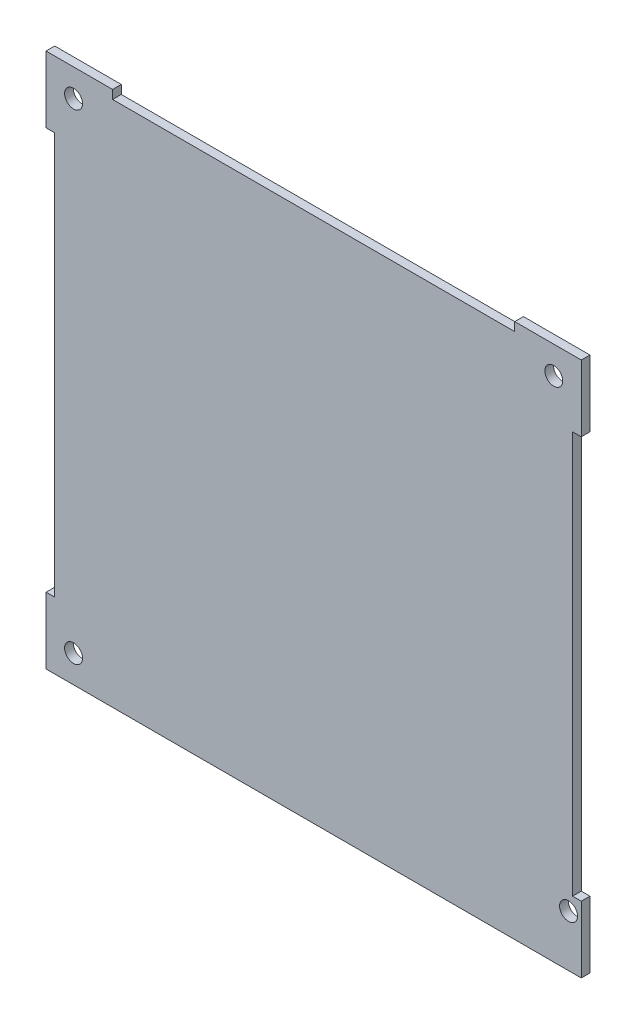
ISO-10303-21;
HEADER;
FILE_DESCRIPTION(('STEP AP214'),'2;1');
FILE_NAME('part.step','',(''),(''),'','','');
FILE_SCHEMA(('AUTOMOTIVE_DESIGN { 1 0 10303 214 1 1 1 1 }'));
ENDSEC;
DATA;
#1=APPLICATION_CONTEXT('core data for automotive mechanical design processes');
#2=APPLICATION_PROTOCOL_DEFINITION('international standard','automotive_design',2000,#1);
#3=PRODUCT_CONTEXT('',#1,'mechanical');
#4=PRODUCT('Part','Part','',(#3));
#5=PRODUCT_RELATED_PRODUCT_CATEGORY('part','',(#4));
#6=PRODUCT_DEFINITION_FORMATION('','',#4);
#7=PRODUCT_DEFINITION_CONTEXT('part definition',#1,'design');
#8=PRODUCT_DEFINITION('design','',#6,#7);
#9=PRODUCT_DEFINITION_SHAPE('','',#8);
#10=(LENGTH_UNIT() NAMED_UNIT(*) SI_UNIT(.MILLI.,.METRE.));
#11=(NAMED_UNIT(*) PLANE_ANGLE_UNIT() SI_UNIT($,.RADIAN.));
#12=(NAMED_UNIT(*) SI_UNIT($,.STERADIAN.) SOLID_ANGLE_UNIT());
#13=UNCERTAINTY_MEASURE_WITH_UNIT(LENGTH_MEASURE(1.E-05),#10,'distance_accuracy_value','');
#14=(GEOMETRIC_REPRESENTATION_CONTEXT(3) GLOBAL_UNCERTAINTY_ASSIGNED_CONTEXT((#13)) GLOBAL_UNIT_ASSIGNED_CONTEXT((#10,
#11,#12)) REPRESENTATION_CONTEXT('',''));
#15=CARTESIAN_POINT('',(0.,0.,0.));
#16=DIRECTION('',(0.,0.,1.));
#17=DIRECTION('',(1.,0.,0.));
#18=AXIS2_PLACEMENT_3D('',#15,#16,#17);
#19=CARTESIAN_POINT('',(46.25,46.25,1.5));
#20=DIRECTION('',(0.,-1.,0.));
#21=DIRECTION('',(1.,0.,0.));
#22=AXIS2_PLACEMENT_3D('',#19,#20,#21);
#23=PLANE('',#22);
#24=DIRECTION('',(-1.,0.,0.));
#25=VECTOR('',#24,1.);
#26=CARTESIAN_POINT('',(46.25,46.25,0.));
#27=LINE('',#26,#25);
#28=CARTESIAN_POINT('',(46.25,46.25,0.));
#29=VERTEX_POINT('',#28);
#30=CARTESIAN_POINT('',(34.75,46.25,0.));
#31=VERTEX_POINT('',#30);
#32=EDGE_CURVE('E282',#29,#31,#27,.T.);
#33=ORIENTED_EDGE('',*,*,#32,.T.);
#34=DIRECTION('',(0.,0.,-1.));
#35=VECTOR('',#34,1.);
#36=CARTESIAN_POINT('',(34.75,46.25,10.));
#37=LINE('',#36,#35);
#38=CARTESIAN_POINT('',(34.75,46.25,1.5));
#39=VERTEX_POINT('',#38);
#40=EDGE_CURVE('E181',#39,#31,#37,.T.);
#41=ORIENTED_EDGE('',*,*,#40,.F.);
#42=DIRECTION('',(-1.,0.,0.));
#43=VECTOR('',#42,1.);
#44=CARTESIAN_POINT('',(46.25,46.25,1.5));
#45=LINE('',#44,#43);
#46=CARTESIAN_POINT('',(46.25,46.25,1.5));
#47=VERTEX_POINT('',#46);
#48=EDGE_CURVE('E269',#47,#39,#45,.T.);
#49=ORIENTED_EDGE('',*,*,#48,.F.);
#50=DIRECTION('',(0.,0.,-1.));
#51=VECTOR('',#50,1.);
#52=CARTESIAN_POINT('',(46.25,46.25,1.5));
#53=LINE('',#52,#51);
#54=EDGE_CURVE('E287',#47,#29,#53,.T.);
#55=ORIENTED_EDGE('',*,*,#54,.T.);
#56=EDGE_LOOP('',(#33,#41,#49,#55));
#57=FACE_BOUND('',#56,.T.);
#58=ADVANCED_FACE('F41',(#57),#23,.F.);
#59=CARTESIAN_POINT('',(-46.25,-46.25,1.5));
#60=DIRECTION('',(1.,0.,0.));
#61=DIRECTION('',(0.,0.,-1.));
#62=AXIS2_PLACEMENT_3D('',#59,#60,#61);
#63=PLANE('',#62);
#64=DIRECTION('',(0.,-1.,0.));
#65=VECTOR('',#64,1.);
#66=CARTESIAN_POINT('',(-46.25,-46.25,0.));
#67=LINE('',#66,#65);
#68=CARTESIAN_POINT('',(-46.25,46.25,0.));
#69=VERTEX_POINT('',#68);
#70=CARTESIAN_POINT('',(-46.25,34.75,0.));
#71=VERTEX_POINT('',#70);
#72=EDGE_CURVE('E273',#69,#71,#67,.T.);
#73=ORIENTED_EDGE('',*,*,#72,.T.);
#74=DIRECTION('',(0.,0.,-1.));
#75=VECTOR('',#74,1.);
#76=CARTESIAN_POINT('',(-46.25,34.75,10.));
#77=LINE('',#76,#75);
#78=CARTESIAN_POINT('',(-46.25,34.75,1.5));
#79=VERTEX_POINT('',#78);
#80=EDGE_CURVE('E196',#79,#71,#77,.T.);
#81=ORIENTED_EDGE('',*,*,#80,.F.);
#82=DIRECTION('',(0.,-1.,0.));
#83=VECTOR('',#82,1.);
#84=CARTESIAN_POINT('',(-46.25,-46.25,1.5));
#85=LINE('',#84,#83);
#86=CARTESIAN_POINT('',(-46.25,46.25,1.5));
#87=VERTEX_POINT('',#86);
#88=EDGE_CURVE('E258',#87,#79,#85,.T.);
#89=ORIENTED_EDGE('',*,*,#88,.F.);
#90=DIRECTION('',(0.,0.,-1.));
#91=VECTOR('',#90,1.);
#92=CARTESIAN_POINT('',(-46.25,46.25,1.5));
#93=LINE('',#92,#91);
#94=EDGE_CURVE('E272',#87,#69,#93,.T.);
#95=ORIENTED_EDGE('',*,*,#94,.T.);
#96=EDGE_LOOP('',(#73,#81,#89,#95));
#97=FACE_BOUND('',#96,.T.);
#98=ADVANCED_FACE('F332',(#97),#63,.F.);
#99=CARTESIAN_POINT('',(46.25,-46.25,1.5));
#100=DIRECTION('',(-1.,0.,0.));
#101=DIRECTION('',(0.,0.,1.));
#102=AXIS2_PLACEMENT_3D('',#99,#100,#101);
#103=PLANE('',#102);
#104=DIRECTION('',(0.,1.,0.));
#105=VECTOR('',#104,1.);
#106=CARTESIAN_POINT('',(46.25,-46.25,1.5));
#107=LINE('',#106,#105);
#108=CARTESIAN_POINT('',(46.25,34.75,1.5));
#109=VERTEX_POINT('',#108);
#110=EDGE_CURVE('E264',#109,#47,#107,.T.);
#111=ORIENTED_EDGE('',*,*,#110,.F.);
#112=DIRECTION('',(0.,0.,-1.));
#113=VECTOR('',#112,1.);
#114=CARTESIAN_POINT('',(46.25,34.75,10.));
#115=LINE('',#114,#113);
#116=CARTESIAN_POINT('',(46.25,34.75,0.));
#117=VERTEX_POINT('',#116);
#118=EDGE_CURVE('E219',#109,#117,#115,.T.);
#119=ORIENTED_EDGE('',*,*,#118,.T.);
#120=DIRECTION('',(0.,1.,0.));
#121=VECTOR('',#120,1.);
#122=CARTESIAN_POINT('',(46.25,-46.25,0.));
#123=LINE('',#122,#121);
#124=EDGE_CURVE('E278',#117,#29,#123,.T.);
#125=ORIENTED_EDGE('',*,*,#124,.T.);
#126=ORIENTED_EDGE('',*,*,#54,.F.);
#127=EDGE_LOOP('',(#111,#119,#125,#126));
#128=FACE_BOUND('',#127,.T.);
#129=ADVANCED_FACE('F344',(#128),#103,.F.);
#130=CARTESIAN_POINT('',(-46.25,-34.75,1.5));
#131=VERTEX_POINT('',#130);
#132=CARTESIAN_POINT('',(-46.25,-46.25,1.5));
#133=VERTEX_POINT('',#132);
#134=EDGE_CURVE('E262',#131,#133,#85,.T.);
#135=ORIENTED_EDGE('',*,*,#134,.F.);
#136=DIRECTION('',(0.,0.,-1.));
#137=VECTOR('',#136,1.);
#138=CARTESIAN_POINT('',(-46.25,-34.75,10.));
#139=LINE('',#138,#137);
#140=CARTESIAN_POINT('',(-46.25,-34.75,0.));
#141=VERTEX_POINT('',#140);
#142=EDGE_CURVE('E199',#131,#141,#139,.T.);
#143=ORIENTED_EDGE('',*,*,#142,.T.);
#144=CARTESIAN_POINT('',(-46.25,-46.25,0.));
#145=VERTEX_POINT('',#144);
#146=EDGE_CURVE('E257',#141,#145,#67,.T.);
#147=ORIENTED_EDGE('',*,*,#146,.T.);
#148=DIRECTION('',(0.,0.,-1.));
#149=VECTOR('',#148,1.);
#150=CARTESIAN_POINT('',(-46.25,-46.25,1.5));
#151=LINE('',#150,#149);
#152=EDGE_CURVE('E11',#133,#145,#151,.T.);
#153=ORIENTED_EDGE('',*,*,#152,.F.);
#154=EDGE_LOOP('',(#135,#143,#147,#153));
#155=FACE_BOUND('',#154,.T.);
#156=ADVANCED_FACE('F43',(#155),#63,.F.);
#157=CARTESIAN_POINT('',(46.25,-46.25,1.5));
#158=DIRECTION('',(0.,1.,0.));
#159=DIRECTION('',(-1.,0.,0.));
#160=AXIS2_PLACEMENT_3D('',#157,#158,#159);
#161=PLANE('',#160);
#162=DIRECTION('',(1.,0.,0.));
#163=VECTOR('',#162,1.);
#164=CARTESIAN_POINT('',(46.25,-46.25,0.));
#165=LINE('',#164,#163);
#166=CARTESIAN_POINT('',(46.25,-46.25,0.));
#167=VERTEX_POINT('',#166);
#168=EDGE_CURVE('E276',#145,#167,#165,.T.);
#169=ORIENTED_EDGE('',*,*,#168,.T.);
#170=DIRECTION('',(0.,0.,-1.));
#171=VECTOR('',#170,1.);
#172=CARTESIAN_POINT('',(46.25,-46.25,1.5));
#173=LINE('',#172,#171);
#174=CARTESIAN_POINT('',(46.25,-46.25,1.5));
#175=VERTEX_POINT('',#174);
#176=EDGE_CURVE('E49',#175,#167,#173,.T.);
#177=ORIENTED_EDGE('',*,*,#176,.F.);
#178=DIRECTION('',(1.,0.,0.));
#179=VECTOR('',#178,1.);
#180=CARTESIAN_POINT('',(46.25,-46.25,1.5));
#181=LINE('',#180,#179);
#182=EDGE_CURVE('E261',#133,#175,#181,.T.);
#183=ORIENTED_EDGE('',*,*,#182,.F.);
#184=ORIENTED_EDGE('',*,*,#152,.T.);
#185=EDGE_LOOP('',(#169,#177,#183,#184));
#186=FACE_BOUND('',#185,.T.);
#187=ADVANCED_FACE('F315',(#186),#161,.F.);
#188=CARTESIAN_POINT('',(46.25,-34.75,0.));
#189=VERTEX_POINT('',#188);
#190=EDGE_CURVE('E279',#167,#189,#123,.T.);
#191=ORIENTED_EDGE('',*,*,#190,.T.);
#192=DIRECTION('',(0.,0.,-1.));
#193=VECTOR('',#192,1.);
#194=CARTESIAN_POINT('',(46.25,-34.75,10.));
#195=LINE('',#194,#193);
#196=CARTESIAN_POINT('',(46.25,-34.75,1.5));
#197=VERTEX_POINT('',#196);
#198=EDGE_CURVE('E218',#197,#189,#195,.T.);
#199=ORIENTED_EDGE('',*,*,#198,.F.);
#200=EDGE_CURVE('E265',#175,#197,#107,.T.);
#201=ORIENTED_EDGE('',*,*,#200,.F.);
#202=ORIENTED_EDGE('',*,*,#176,.T.);
#203=EDGE_LOOP('',(#191,#199,#201,#202));
#204=FACE_BOUND('',#203,.T.);
#205=ADVANCED_FACE('F294',(#204),#103,.F.);
#206=CARTESIAN_POINT('',(-34.75,46.25,1.5));
#207=VERTEX_POINT('',#206);
#208=EDGE_CURVE('E268',#207,#87,#45,.T.);
#209=ORIENTED_EDGE('',*,*,#208,.F.);
#210=DIRECTION('',(0.,0.,-1.));
#211=VECTOR('',#210,1.);
#212=CARTESIAN_POINT('',(-34.75,46.25,10.));
#213=LINE('',#212,#211);
#214=CARTESIAN_POINT('',(-34.75,46.25,0.));
#215=VERTEX_POINT('',#214);
#216=EDGE_CURVE('E165',#207,#215,#213,.T.);
#217=ORIENTED_EDGE('',*,*,#216,.T.);
#218=EDGE_CURVE('E176',#215,#69,#27,.T.);
#219=ORIENTED_EDGE('',*,*,#218,.T.);
#220=ORIENTED_EDGE('',*,*,#94,.F.);
#221=EDGE_LOOP('',(#209,#217,#219,#220));
#222=FACE_BOUND('',#221,.T.);
#223=ADVANCED_FACE('F334',(#222),#23,.F.);
#224=CARTESIAN_POINT('',(0.,0.,1.5));
#225=DIRECTION('',(0.,0.,1.));
#226=DIRECTION('',(1.,0.,0.));
#227=AXIS2_PLACEMENT_3D('',#224,#225,#226);
#228=PLANE('',#227);
#229=DIRECTION('',(0.,1.,0.));
#230=VECTOR('',#229,1.);
#231=CARTESIAN_POINT('',(34.75,0.,1.5));
#232=LINE('',#231,#230);
#233=CARTESIAN_POINT('',(34.75,44.75,1.5));
#234=VERTEX_POINT('',#233);
#235=EDGE_CURVE('E187',#234,#39,#232,.T.);
#236=ORIENTED_EDGE('',*,*,#235,.F.);
#237=DIRECTION('',(1.,0.,0.));
#238=VECTOR('',#237,1.);
#239=CARTESIAN_POINT('',(0.,44.75,1.5));
#240=LINE('',#239,#238);
#241=CARTESIAN_POINT('',(-34.75,44.75,1.5));
#242=VERTEX_POINT('',#241);
#243=EDGE_CURVE('E183',#242,#234,#240,.T.);
#244=ORIENTED_EDGE('',*,*,#243,.F.);
#245=DIRECTION('',(0.,-1.,0.));
#246=VECTOR('',#245,1.);
#247=CARTESIAN_POINT('',(-34.75,0.,1.5));
#248=LINE('',#247,#246);
#249=EDGE_CURVE('E162',#207,#242,#248,.T.);
#250=ORIENTED_EDGE('',*,*,#249,.F.);
#251=ORIENTED_EDGE('',*,*,#208,.T.);
#252=ORIENTED_EDGE('',*,*,#88,.T.);
#253=DIRECTION('',(-1.,0.,0.));
#254=VECTOR('',#253,1.);
#255=CARTESIAN_POINT('',(0.,34.75,1.5));
#256=LINE('',#255,#254);
#257=CARTESIAN_POINT('',(-44.75,34.75,1.5));
#258=VERTEX_POINT('',#257);
#259=EDGE_CURVE('E208',#258,#79,#256,.T.);
#260=ORIENTED_EDGE('',*,*,#259,.F.);
#261=DIRECTION('',(0.,1.,0.));
#262=VECTOR('',#261,1.);
#263=CARTESIAN_POINT('',(-44.75,0.,1.5));
#264=LINE('',#263,#262);
#265=CARTESIAN_POINT('',(-44.75,-34.75,1.5));
#266=VERTEX_POINT('',#265);
#267=EDGE_CURVE('E198',#266,#258,#264,.T.);
#268=ORIENTED_EDGE('',*,*,#267,.F.);
#269=DIRECTION('',(1.,0.,0.));
#270=VECTOR('',#269,1.);
#271=CARTESIAN_POINT('',(0.,-34.75,1.5));
#272=LINE('',#271,#270);
#273=EDGE_CURVE('E206',#131,#266,#272,.T.);
#274=ORIENTED_EDGE('',*,*,#273,.F.);
#275=ORIENTED_EDGE('',*,*,#134,.T.);
#276=ORIENTED_EDGE('',*,*,#182,.T.);
#277=ORIENTED_EDGE('',*,*,#200,.T.);
#278=DIRECTION('',(1.,0.,0.));
#279=VECTOR('',#278,1.);
#280=CARTESIAN_POINT('',(0.,-34.75,1.5));
#281=LINE('',#280,#279);
#282=CARTESIAN_POINT('',(44.75,-34.75,1.5));
#283=VERTEX_POINT('',#282);
#284=EDGE_CURVE('E222',#283,#197,#281,.T.);
#285=ORIENTED_EDGE('',*,*,#284,.F.);
#286=DIRECTION('',(0.,-1.,0.));
#287=VECTOR('',#286,1.);
#288=CARTESIAN_POINT('',(44.75,0.,1.5));
#289=LINE('',#288,#287);
#290=CARTESIAN_POINT('',(44.75,34.75,1.5));
#291=VERTEX_POINT('',#290);
#292=EDGE_CURVE('E229',#291,#283,#289,.T.);
#293=ORIENTED_EDGE('',*,*,#292,.F.);
#294=DIRECTION('',(-1.,0.,0.));
#295=VECTOR('',#294,1.);
#296=CARTESIAN_POINT('',(0.,34.75,1.5));
#297=LINE('',#296,#295);
#298=EDGE_CURVE('E231',#109,#291,#297,.T.);
#299=ORIENTED_EDGE('',*,*,#298,.F.);
#300=ORIENTED_EDGE('',*,*,#110,.T.);
#301=ORIENTED_EDGE('',*,*,#48,.T.);
#302=EDGE_LOOP('',(#236,#244,#250,#251,#252,#260,#268,#274,#275,#276,#277,#285,#293,#299,#300,#301));
#303=FACE_BOUND('',#302,.T.);
#304=CARTESIAN_POINT('',(-41.5000000002001,41.5000000000005,1.5));
#305=DIRECTION('',(0.,0.,1.));
#306=DIRECTION('',(1.,0.,0.));
#307=AXIS2_PLACEMENT_3D('',#304,#305,#306);
#308=CIRCLE('',#307,1.54999999999999);
#309=CARTESIAN_POINT('',(-39.9500000002001,41.5000000000005,1.5));
#310=VERTEX_POINT('',#309);
#311=EDGE_CURVE('E233',#310,#310,#308,.T.);
#312=ORIENTED_EDGE('',*,*,#311,.F.);
#313=EDGE_LOOP('',(#312));
#314=FACE_BOUND('',#313,.T.);
#315=CARTESIAN_POINT('',(41.5,41.5,1.5));
#316=DIRECTION('',(0.,0.,1.));
#317=DIRECTION('',(1.,0.,0.));
#318=AXIS2_PLACEMENT_3D('',#315,#316,#317);
#319=CIRCLE('',#318,1.54999999999999);
#320=CARTESIAN_POINT('',(43.05,41.5,1.5));
#321=VERTEX_POINT('',#320);
#322=EDGE_CURVE('E239',#321,#321,#319,.T.);
#323=ORIENTED_EDGE('',*,*,#322,.F.);
#324=EDGE_LOOP('',(#323));
#325=FACE_BOUND('',#324,.T.);
#326=CARTESIAN_POINT('',(44.0499999999314,-37.3300000000152,1.5));
#327=DIRECTION('',(0.,0.,1.));
#328=DIRECTION('',(1.,0.,0.));
#329=AXIS2_PLACEMENT_3D('',#326,#327,#328);
#330=CIRCLE('',#329,1.54999999999999);
#331=CARTESIAN_POINT('',(45.5999999999314,-37.3300000000152,1.5));
#332=VERTEX_POINT('',#331);
#333=EDGE_CURVE('E245',#332,#332,#330,.T.);
#334=ORIENTED_EDGE('',*,*,#333,.F.);
#335=EDGE_LOOP('',(#334));
#336=FACE_BOUND('',#335,.T.);
#337=CARTESIAN_POINT('',(-41.5,-41.5,1.5));
#338=DIRECTION('',(0.,0.,1.));
#339=DIRECTION('',(1.,0.,0.));
#340=AXIS2_PLACEMENT_3D('',#337,#338,#339);
#341=CIRCLE('',#340,1.54999999999999);
#342=CARTESIAN_POINT('',(-39.9500000000001,-41.5,1.5));
#343=VERTEX_POINT('',#342);
#344=EDGE_CURVE('E251',#343,#343,#341,.T.);
#345=ORIENTED_EDGE('',*,*,#344,.F.);
#346=EDGE_LOOP('',(#345));
#347=FACE_BOUND('',#346,.T.);
#348=ADVANCED_FACE('F309',(#303,#314,#325,#336,#347),#228,.T.);
#349=CARTESIAN_POINT('',(0.,0.,0.));
#350=DIRECTION('',(0.,0.,1.));
#351=DIRECTION('',(1.,0.,0.));
#352=AXIS2_PLACEMENT_3D('',#349,#350,#351);
#353=PLANE('',#352);
#354=CARTESIAN_POINT('',(-41.5000000002001,41.5000000000005,0.));
#355=DIRECTION('',(0.,0.,1.));
#356=DIRECTION('',(1.,0.,0.));
#357=AXIS2_PLACEMENT_3D('',#354,#355,#356);
#358=CIRCLE('',#357,1.55);
#359=CARTESIAN_POINT('',(-39.9500000002001,41.5000000000005,0.));
#360=VERTEX_POINT('',#359);
#361=EDGE_CURVE('E236',#360,#360,#358,.T.);
#362=ORIENTED_EDGE('',*,*,#361,.T.);
#363=EDGE_LOOP('',(#362));
#364=FACE_BOUND('',#363,.T.);
#365=CARTESIAN_POINT('',(41.5,41.5,0.));
#366=DIRECTION('',(0.,0.,1.));
#367=DIRECTION('',(1.,0.,0.));
#368=AXIS2_PLACEMENT_3D('',#365,#366,#367);
#369=CIRCLE('',#368,1.55);
#370=CARTESIAN_POINT('',(43.05,41.5,0.));
#371=VERTEX_POINT('',#370);
#372=EDGE_CURVE('E242',#371,#371,#369,.T.);
#373=ORIENTED_EDGE('',*,*,#372,.T.);
#374=EDGE_LOOP('',(#373));
#375=FACE_BOUND('',#374,.T.);
#376=CARTESIAN_POINT('',(44.0499999999314,-37.3300000000152,0.));
#377=DIRECTION('',(0.,0.,1.));
#378=DIRECTION('',(1.,0.,0.));
#379=AXIS2_PLACEMENT_3D('',#376,#377,#378);
#380=CIRCLE('',#379,1.55);
#381=CARTESIAN_POINT('',(45.5999999999314,-37.3300000000152,0.));
#382=VERTEX_POINT('',#381);
#383=EDGE_CURVE('E248',#382,#382,#380,.T.);
#384=ORIENTED_EDGE('',*,*,#383,.T.);
#385=EDGE_LOOP('',(#384));
#386=FACE_BOUND('',#385,.T.);
#387=CARTESIAN_POINT('',(-41.5,-41.5,0.));
#388=DIRECTION('',(0.,0.,1.));
#389=DIRECTION('',(1.,0.,0.));
#390=AXIS2_PLACEMENT_3D('',#387,#388,#389);
#391=CIRCLE('',#390,1.55);
#392=CARTESIAN_POINT('',(-39.95,-41.5,0.));
#393=VERTEX_POINT('',#392);
#394=EDGE_CURVE('E254',#393,#393,#391,.T.);
#395=ORIENTED_EDGE('',*,*,#394,.T.);
#396=EDGE_LOOP('',(#395));
#397=FACE_BOUND('',#396,.T.);
#398=DIRECTION('',(-1.,0.,0.));
#399=VECTOR('',#398,1.);
#400=CARTESIAN_POINT('',(34.75,44.75,0.));
#401=LINE('',#400,#399);
#402=CARTESIAN_POINT('',(34.75,44.75,0.));
#403=VERTEX_POINT('',#402);
#404=CARTESIAN_POINT('',(-34.75,44.75,0.));
#405=VERTEX_POINT('',#404);
#406=EDGE_CURVE('E169',#403,#405,#401,.T.);
#407=ORIENTED_EDGE('',*,*,#406,.F.);
#408=DIRECTION('',(0.,-1.,0.));
#409=VECTOR('',#408,1.);
#410=CARTESIAN_POINT('',(34.75,46.25,0.));
#411=LINE('',#410,#409);
#412=EDGE_CURVE('E56',#31,#403,#411,.T.);
#413=ORIENTED_EDGE('',*,*,#412,.F.);
#414=ORIENTED_EDGE('',*,*,#32,.F.);
#415=ORIENTED_EDGE('',*,*,#124,.F.);
#416=DIRECTION('',(1.,0.,0.));
#417=VECTOR('',#416,1.);
#418=CARTESIAN_POINT('',(46.25,34.75,0.));
#419=LINE('',#418,#417);
#420=CARTESIAN_POINT('',(44.75,34.75,0.));
#421=VERTEX_POINT('',#420);
#422=EDGE_CURVE('E216',#421,#117,#419,.T.);
#423=ORIENTED_EDGE('',*,*,#422,.F.);
#424=DIRECTION('',(0.,1.,0.));
#425=VECTOR('',#424,1.);
#426=CARTESIAN_POINT('',(44.75,34.75,0.));
#427=LINE('',#426,#425);
#428=CARTESIAN_POINT('',(44.75,-34.75,0.));
#429=VERTEX_POINT('',#428);
#430=EDGE_CURVE('E213',#429,#421,#427,.T.);
#431=ORIENTED_EDGE('',*,*,#430,.F.);
#432=DIRECTION('',(-1.,0.,0.));
#433=VECTOR('',#432,1.);
#434=CARTESIAN_POINT('',(46.25,-34.75,0.));
#435=LINE('',#434,#433);
#436=EDGE_CURVE('E210',#189,#429,#435,.T.);
#437=ORIENTED_EDGE('',*,*,#436,.F.);
#438=ORIENTED_EDGE('',*,*,#190,.F.);
#439=ORIENTED_EDGE('',*,*,#168,.F.);
#440=ORIENTED_EDGE('',*,*,#146,.F.);
#441=DIRECTION('',(-1.,0.,0.));
#442=VECTOR('',#441,1.);
#443=CARTESIAN_POINT('',(-46.25,-34.75,0.));
#444=LINE('',#443,#442);
#445=CARTESIAN_POINT('',(-44.75,-34.75,0.));
#446=VERTEX_POINT('',#445);
#447=EDGE_CURVE('E193',#446,#141,#444,.T.);
#448=ORIENTED_EDGE('',*,*,#447,.F.);
#449=DIRECTION('',(0.,-1.,0.));
#450=VECTOR('',#449,1.);
#451=CARTESIAN_POINT('',(-44.75,34.75,0.));
#452=LINE('',#451,#450);
#453=CARTESIAN_POINT('',(-44.75,34.75,0.));
#454=VERTEX_POINT('',#453);
#455=EDGE_CURVE('E190',#454,#446,#452,.T.);
#456=ORIENTED_EDGE('',*,*,#455,.F.);
#457=DIRECTION('',(1.,0.,0.));
#458=VECTOR('',#457,1.);
#459=CARTESIAN_POINT('',(-46.25,34.75,0.));
#460=LINE('',#459,#458);
#461=EDGE_CURVE('E64',#71,#454,#460,.T.);
#462=ORIENTED_EDGE('',*,*,#461,.F.);
#463=ORIENTED_EDGE('',*,*,#72,.F.);
#464=ORIENTED_EDGE('',*,*,#218,.F.);
#465=DIRECTION('',(0.,1.,0.));
#466=VECTOR('',#465,1.);
#467=CARTESIAN_POINT('',(-34.75,46.25,0.));
#468=LINE('',#467,#466);
#469=EDGE_CURVE('E159',#405,#215,#468,.T.);
#470=ORIENTED_EDGE('',*,*,#469,.F.);
#471=EDGE_LOOP('',(#407,#413,#414,#415,#423,#431,#437,#438,#439,#440,#448,#456,#462,#463,#464,#470));
#472=FACE_BOUND('',#471,.T.);
#473=ADVANCED_FACE('F174',(#364,#375,#386,#397,#472),#353,.F.);
#474=CARTESIAN_POINT('',(-41.5,-41.5,1.5));
#475=DIRECTION('',(0.,0.,1.));
#476=DIRECTION('',(1.,0.,0.));
#477=AXIS2_PLACEMENT_3D('',#474,#475,#476);
#478=CYLINDRICAL_SURFACE('',#477,1.55);
#479=ORIENTED_EDGE('',*,*,#394,.F.);
#480=EDGE_LOOP('',(#479));
#481=FACE_BOUND('',#480,.T.);
#482=ORIENTED_EDGE('',*,*,#344,.T.);
#483=EDGE_LOOP('',(#482));
#484=FACE_BOUND('',#483,.T.);
#485=ADVANCED_FACE('F411',(#481,#484),#478,.F.);
#486=CARTESIAN_POINT('',(44.0499999999314,-37.3300000000152,1.5));
#487=DIRECTION('',(0.,0.,1.));
#488=DIRECTION('',(1.,0.,0.));
#489=AXIS2_PLACEMENT_3D('',#486,#487,#488);
#490=CYLINDRICAL_SURFACE('',#489,1.55);
#491=ORIENTED_EDGE('',*,*,#383,.F.);
#492=EDGE_LOOP('',(#491));
#493=FACE_BOUND('',#492,.T.);
#494=ORIENTED_EDGE('',*,*,#333,.T.);
#495=EDGE_LOOP('',(#494));
#496=FACE_BOUND('',#495,.T.);
#497=ADVANCED_FACE('F420',(#493,#496),#490,.F.);
#498=CARTESIAN_POINT('',(41.5,41.5,1.5));
#499=DIRECTION('',(0.,0.,1.));
#500=DIRECTION('',(1.,0.,0.));
#501=AXIS2_PLACEMENT_3D('',#498,#499,#500);
#502=CYLINDRICAL_SURFACE('',#501,1.55);
#503=ORIENTED_EDGE('',*,*,#372,.F.);
#504=EDGE_LOOP('',(#503));
#505=FACE_BOUND('',#504,.T.);
#506=ORIENTED_EDGE('',*,*,#322,.T.);
#507=EDGE_LOOP('',(#506));
#508=FACE_BOUND('',#507,.T.);
#509=ADVANCED_FACE('F427',(#505,#508),#502,.F.);
#510=CARTESIAN_POINT('',(-41.5000000002001,41.5000000000005,1.5));
#511=DIRECTION('',(0.,0.,1.));
#512=DIRECTION('',(1.,0.,0.));
#513=AXIS2_PLACEMENT_3D('',#510,#511,#512);
#514=CYLINDRICAL_SURFACE('',#513,1.54999999999999);
#515=ORIENTED_EDGE('',*,*,#361,.F.);
#516=EDGE_LOOP('',(#515));
#517=FACE_BOUND('',#516,.T.);
#518=ORIENTED_EDGE('',*,*,#311,.T.);
#519=EDGE_LOOP('',(#518));
#520=FACE_BOUND('',#519,.T.);
#521=ADVANCED_FACE('F358',(#517,#520),#514,.F.);
#522=CARTESIAN_POINT('',(46.25,34.75,10.));
#523=DIRECTION('',(0.,1.,0.));
#524=DIRECTION('',(0.,0.,1.));
#525=AXIS2_PLACEMENT_3D('',#522,#523,#524);
#526=PLANE('',#525);
#527=ORIENTED_EDGE('',*,*,#298,.T.);
#528=DIRECTION('',(0.,0.,-1.));
#529=VECTOR('',#528,1.);
#530=CARTESIAN_POINT('',(44.75,34.75,10.));
#531=LINE('',#530,#529);
#532=EDGE_CURVE('E223',#291,#421,#531,.T.);
#533=ORIENTED_EDGE('',*,*,#532,.T.);
#534=ORIENTED_EDGE('',*,*,#422,.T.);
#535=ORIENTED_EDGE('',*,*,#118,.F.);
#536=EDGE_LOOP('',(#527,#533,#534,#535));
#537=FACE_BOUND('',#536,.T.);
#538=ADVANCED_FACE('F347',(#537),#526,.F.);
#539=CARTESIAN_POINT('',(44.75,34.75,10.));
#540=DIRECTION('',(-1.,0.,0.));
#541=DIRECTION('',(0.,-1.,0.));
#542=AXIS2_PLACEMENT_3D('',#539,#540,#541);
#543=PLANE('',#542);
#544=ORIENTED_EDGE('',*,*,#292,.T.);
#545=DIRECTION('',(0.,0.,-1.));
#546=VECTOR('',#545,1.);
#547=CARTESIAN_POINT('',(44.75,-34.75,10.));
#548=LINE('',#547,#546);
#549=EDGE_CURVE('E225',#283,#429,#548,.T.);
#550=ORIENTED_EDGE('',*,*,#549,.T.);
#551=ORIENTED_EDGE('',*,*,#430,.T.);
#552=ORIENTED_EDGE('',*,*,#532,.F.);
#553=EDGE_LOOP('',(#544,#550,#551,#552));
#554=FACE_BOUND('',#553,.T.);
#555=ADVANCED_FACE('F350',(#554),#543,.F.);
#556=CARTESIAN_POINT('',(46.25,-34.75,10.));
#557=DIRECTION('',(0.,-1.,0.));
#558=DIRECTION('',(0.,0.,-1.));
#559=AXIS2_PLACEMENT_3D('',#556,#557,#558);
#560=PLANE('',#559);
#561=ORIENTED_EDGE('',*,*,#284,.T.);
#562=ORIENTED_EDGE('',*,*,#198,.T.);
#563=ORIENTED_EDGE('',*,*,#436,.T.);
#564=ORIENTED_EDGE('',*,*,#549,.F.);
#565=EDGE_LOOP('',(#561,#562,#563,#564));
#566=FACE_BOUND('',#565,.T.);
#567=ADVANCED_FACE('F305',(#566),#560,.F.);
#568=CARTESIAN_POINT('',(-46.25,34.75,10.));
#569=DIRECTION('',(0.,1.,0.));
#570=DIRECTION('',(0.,0.,1.));
#571=AXIS2_PLACEMENT_3D('',#568,#569,#570);
#572=PLANE('',#571);
#573=ORIENTED_EDGE('',*,*,#259,.T.);
#574=ORIENTED_EDGE('',*,*,#80,.T.);
#575=ORIENTED_EDGE('',*,*,#461,.T.);
#576=DIRECTION('',(0.,0.,-1.));
#577=VECTOR('',#576,1.);
#578=CARTESIAN_POINT('',(-44.75,34.75,10.));
#579=LINE('',#578,#577);
#580=EDGE_CURVE('E195',#258,#454,#579,.T.);
#581=ORIENTED_EDGE('',*,*,#580,.F.);
#582=EDGE_LOOP('',(#573,#574,#575,#581));
#583=FACE_BOUND('',#582,.T.);
#584=ADVANCED_FACE('F326',(#583),#572,.F.);
#585=CARTESIAN_POINT('',(-46.25,-34.75,10.));
#586=DIRECTION('',(0.,-1.,0.));
#587=DIRECTION('',(0.,0.,-1.));
#588=AXIS2_PLACEMENT_3D('',#585,#586,#587);
#589=PLANE('',#588);
#590=ORIENTED_EDGE('',*,*,#273,.T.);
#591=DIRECTION('',(0.,0.,-1.));
#592=VECTOR('',#591,1.);
#593=CARTESIAN_POINT('',(-44.75,-34.75,10.));
#594=LINE('',#593,#592);
#595=EDGE_CURVE('E202',#266,#446,#594,.T.);
#596=ORIENTED_EDGE('',*,*,#595,.T.);
#597=ORIENTED_EDGE('',*,*,#447,.T.);
#598=ORIENTED_EDGE('',*,*,#142,.F.);
#599=EDGE_LOOP('',(#590,#596,#597,#598));
#600=FACE_BOUND('',#599,.T.);
#601=ADVANCED_FACE('F320',(#600),#589,.F.);
#602=CARTESIAN_POINT('',(-44.75,34.75,10.));
#603=DIRECTION('',(1.,0.,0.));
#604=DIRECTION('',(0.,1.,0.));
#605=AXIS2_PLACEMENT_3D('',#602,#603,#604);
#606=PLANE('',#605);
#607=ORIENTED_EDGE('',*,*,#267,.T.);
#608=ORIENTED_EDGE('',*,*,#580,.T.);
#609=ORIENTED_EDGE('',*,*,#455,.T.);
#610=ORIENTED_EDGE('',*,*,#595,.F.);
#611=EDGE_LOOP('',(#607,#608,#609,#610));
#612=FACE_BOUND('',#611,.T.);
#613=ADVANCED_FACE('F324',(#612),#606,.F.);
#614=CARTESIAN_POINT('',(34.75,46.25,10.));
#615=DIRECTION('',(1.,0.,0.));
#616=DIRECTION('',(0.,0.,-1.));
#617=AXIS2_PLACEMENT_3D('',#614,#615,#616);
#618=PLANE('',#617);
#619=ORIENTED_EDGE('',*,*,#235,.T.);
#620=ORIENTED_EDGE('',*,*,#40,.T.);
#621=ORIENTED_EDGE('',*,*,#412,.T.);
#622=DIRECTION('',(0.,0.,-1.));
#623=VECTOR('',#622,1.);
#624=CARTESIAN_POINT('',(34.75,44.75,10.));
#625=LINE('',#624,#623);
#626=EDGE_CURVE('E166',#234,#403,#625,.T.);
#627=ORIENTED_EDGE('',*,*,#626,.F.);
#628=EDGE_LOOP('',(#619,#620,#621,#627));
#629=FACE_BOUND('',#628,.T.);
#630=ADVANCED_FACE('F335',(#629),#618,.F.);
#631=CARTESIAN_POINT('',(-34.75,46.25,10.));
#632=DIRECTION('',(-1.,0.,0.));
#633=DIRECTION('',(0.,0.,1.));
#634=AXIS2_PLACEMENT_3D('',#631,#632,#633);
#635=PLANE('',#634);
#636=ORIENTED_EDGE('',*,*,#249,.T.);
#637=DIRECTION('',(0.,0.,-1.));
#638=VECTOR('',#637,1.);
#639=CARTESIAN_POINT('',(-34.75,44.75,10.));
#640=LINE('',#639,#638);
#641=EDGE_CURVE('E155',#242,#405,#640,.T.);
#642=ORIENTED_EDGE('',*,*,#641,.T.);
#643=ORIENTED_EDGE('',*,*,#469,.T.);
#644=ORIENTED_EDGE('',*,*,#216,.F.);
#645=EDGE_LOOP('',(#636,#642,#643,#644));
#646=FACE_BOUND('',#645,.T.);
#647=ADVANCED_FACE('F157',(#646),#635,.F.);
#648=CARTESIAN_POINT('',(34.75,44.75,10.));
#649=DIRECTION('',(0.,-1.,0.));
#650=DIRECTION('',(0.,0.,-1.));
#651=AXIS2_PLACEMENT_3D('',#648,#649,#650);
#652=PLANE('',#651);
#653=ORIENTED_EDGE('',*,*,#243,.T.);
#654=ORIENTED_EDGE('',*,*,#626,.T.);
#655=ORIENTED_EDGE('',*,*,#406,.T.);
#656=ORIENTED_EDGE('',*,*,#641,.F.);
#657=EDGE_LOOP('',(#653,#654,#655,#656));
#658=FACE_BOUND('',#657,.T.);
#659=ADVANCED_FACE('F170',(#658),#652,.F.);
#660=CLOSED_SHELL('',(#58,#98,#129,#156,#187,#205,#223,#348,#473,#485,#497,#509,#521,#538,#555,
#567,#584,#601,#613,#630,#647,#659));
#661=MANIFOLD_SOLID_BREP('B2',#660);
#662=ADVANCED_BREP_SHAPE_REPRESENTATION('',(#18,#661),#14);
#663=SHAPE_DEFINITION_REPRESENTATION(#9,#662);
ENDSEC;
END-ISO-10303-21;
